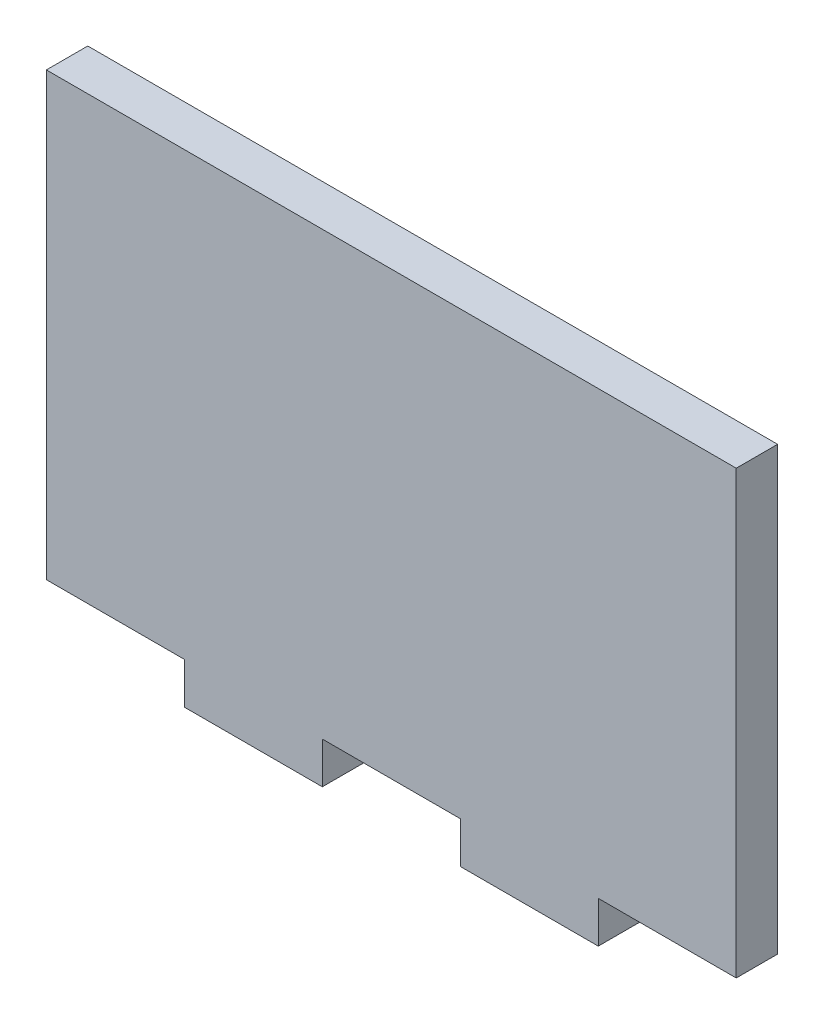
ISO-10303-21;
HEADER;
FILE_DESCRIPTION(('STEP AP214'),'2;1');
FILE_NAME('part.step','',(''),(''),'','','');
FILE_SCHEMA(('AUTOMOTIVE_DESIGN { 1 0 10303 214 1 1 1 1 }'));
ENDSEC;
DATA;
#1=APPLICATION_CONTEXT('core data for automotive mechanical design processes');
#2=APPLICATION_PROTOCOL_DEFINITION('international standard','automotive_design',2000,#1);
#3=PRODUCT_CONTEXT('',#1,'mechanical');
#4=PRODUCT('Part','Part','',(#3));
#5=PRODUCT_RELATED_PRODUCT_CATEGORY('part','',(#4));
#6=PRODUCT_DEFINITION_FORMATION('','',#4);
#7=PRODUCT_DEFINITION_CONTEXT('part definition',#1,'design');
#8=PRODUCT_DEFINITION('design','',#6,#7);
#9=PRODUCT_DEFINITION_SHAPE('','',#8);
#10=(LENGTH_UNIT() NAMED_UNIT(*) SI_UNIT(.MILLI.,.METRE.));
#11=(NAMED_UNIT(*) PLANE_ANGLE_UNIT() SI_UNIT($,.RADIAN.));
#12=(NAMED_UNIT(*) SI_UNIT($,.STERADIAN.) SOLID_ANGLE_UNIT());
#13=UNCERTAINTY_MEASURE_WITH_UNIT(LENGTH_MEASURE(1.E-05),#10,'distance_accuracy_value','');
#14=(GEOMETRIC_REPRESENTATION_CONTEXT(3) GLOBAL_UNCERTAINTY_ASSIGNED_CONTEXT((#13)) GLOBAL_UNIT_ASSIGNED_CONTEXT((#10,
#11,#12)) REPRESENTATION_CONTEXT('',''));
#15=CARTESIAN_POINT('',(0.,0.,0.));
#16=DIRECTION('',(0.,0.,1.));
#17=DIRECTION('',(1.,0.,0.));
#18=AXIS2_PLACEMENT_3D('',#15,#16,#17);
#19=CARTESIAN_POINT('',(0.,0.,6.));
#20=DIRECTION('',(0.,1.,0.));
#21=DIRECTION('',(-1.,0.,0.));
#22=AXIS2_PLACEMENT_3D('',#19,#20,#21);
#23=PLANE('',#22);
#24=DIRECTION('',(0.,0.,-1.));
#25=VECTOR('',#24,1.);
#26=CARTESIAN_POINT('',(-40.,0.,6.));
#27=LINE('',#26,#25);
#28=CARTESIAN_POINT('',(-40.,0.,6.));
#29=VERTEX_POINT('',#28);
#30=CARTESIAN_POINT('',(-40.,0.,0.));
#31=VERTEX_POINT('',#30);
#32=EDGE_CURVE('E58',#29,#31,#27,.T.);
#33=ORIENTED_EDGE('',*,*,#32,.F.);
#34=DIRECTION('',(1.,0.,0.));
#35=VECTOR('',#34,1.);
#36=CARTESIAN_POINT('',(0.,0.,6.));
#37=LINE('',#36,#35);
#38=CARTESIAN_POINT('',(-60.,0.,6.));
#39=VERTEX_POINT('',#38);
#40=EDGE_CURVE('E211',#39,#29,#37,.T.);
#41=ORIENTED_EDGE('',*,*,#40,.F.);
#42=DIRECTION('',(0.,0.,1.));
#43=VECTOR('',#42,1.);
#44=CARTESIAN_POINT('',(-60.,0.,6.));
#45=LINE('',#44,#43);
#46=CARTESIAN_POINT('',(-60.,0.,0.));
#47=VERTEX_POINT('',#46);
#48=EDGE_CURVE('E152',#47,#39,#45,.T.);
#49=ORIENTED_EDGE('',*,*,#48,.F.);
#50=DIRECTION('',(1.,0.,0.));
#51=VECTOR('',#50,1.);
#52=CARTESIAN_POINT('',(0.,0.,0.));
#53=LINE('',#52,#51);
#54=EDGE_CURVE('E182',#47,#31,#53,.T.);
#55=ORIENTED_EDGE('',*,*,#54,.T.);
#56=EDGE_LOOP('',(#33,#41,#49,#55));
#57=FACE_BOUND('',#56,.T.);
#58=ADVANCED_FACE('F33',(#57),#23,.F.);
#59=DIRECTION('',(0.,0.,1.));
#60=VECTOR('',#59,1.);
#61=CARTESIAN_POINT('',(-20.,0.,6.));
#62=LINE('',#61,#60);
#63=CARTESIAN_POINT('',(-20.,0.,0.));
#64=VERTEX_POINT('',#63);
#65=CARTESIAN_POINT('',(-20.,0.,6.));
#66=VERTEX_POINT('',#65);
#67=EDGE_CURVE('E146',#64,#66,#62,.T.);
#68=ORIENTED_EDGE('',*,*,#67,.F.);
#69=CARTESIAN_POINT('',(0.,0.,0.));
#70=VERTEX_POINT('',#69);
#71=EDGE_CURVE('E180',#64,#70,#53,.T.);
#72=ORIENTED_EDGE('',*,*,#71,.T.);
#73=DIRECTION('',(0.,0.,-1.));
#74=VECTOR('',#73,1.);
#75=CARTESIAN_POINT('',(0.,0.,6.));
#76=LINE('',#75,#74);
#77=CARTESIAN_POINT('',(0.,0.,6.));
#78=VERTEX_POINT('',#77);
#79=EDGE_CURVE('E188',#78,#70,#76,.T.);
#80=ORIENTED_EDGE('',*,*,#79,.F.);
#81=EDGE_CURVE('E37',#66,#78,#37,.T.);
#82=ORIENTED_EDGE('',*,*,#81,.F.);
#83=EDGE_LOOP('',(#68,#72,#80,#82));
#84=FACE_BOUND('',#83,.T.);
#85=ADVANCED_FACE('F269',(#84),#23,.F.);
#86=DIRECTION('',(0.,0.,-1.));
#87=VECTOR('',#86,1.);
#88=CARTESIAN_POINT('',(-80.,0.,6.));
#89=LINE('',#88,#87);
#90=CARTESIAN_POINT('',(-80.,0.,6.));
#91=VERTEX_POINT('',#90);
#92=CARTESIAN_POINT('',(-80.,0.,0.));
#93=VERTEX_POINT('',#92);
#94=EDGE_CURVE('E149',#91,#93,#89,.T.);
#95=ORIENTED_EDGE('',*,*,#94,.F.);
#96=CARTESIAN_POINT('',(-100.,0.,6.));
#97=VERTEX_POINT('',#96);
#98=EDGE_CURVE('E206',#97,#91,#37,.T.);
#99=ORIENTED_EDGE('',*,*,#98,.F.);
#100=DIRECTION('',(0.,0.,-1.));
#101=VECTOR('',#100,1.);
#102=CARTESIAN_POINT('',(-100.,0.,6.));
#103=LINE('',#102,#101);
#104=CARTESIAN_POINT('',(-100.,0.,0.));
#105=VERTEX_POINT('',#104);
#106=EDGE_CURVE('E199',#97,#105,#103,.T.);
#107=ORIENTED_EDGE('',*,*,#106,.T.);
#108=EDGE_CURVE('E195',#105,#93,#53,.T.);
#109=ORIENTED_EDGE('',*,*,#108,.T.);
#110=EDGE_LOOP('',(#95,#99,#107,#109));
#111=FACE_BOUND('',#110,.T.);
#112=ADVANCED_FACE('F234',(#111),#23,.F.);
#113=CARTESIAN_POINT('',(0.,0.,6.));
#114=DIRECTION('',(-1.,0.,0.));
#115=DIRECTION('',(0.,-1.,0.));
#116=AXIS2_PLACEMENT_3D('',#113,#114,#115);
#117=PLANE('',#116);
#118=DIRECTION('',(0.,1.,0.));
#119=VECTOR('',#118,1.);
#120=CARTESIAN_POINT('',(0.,0.,0.));
#121=LINE('',#120,#119);
#122=CARTESIAN_POINT('',(0.,64.,0.));
#123=VERTEX_POINT('',#122);
#124=EDGE_CURVE('E221',#70,#123,#121,.T.);
#125=ORIENTED_EDGE('',*,*,#124,.T.);
#126=DIRECTION('',(0.,0.,-1.));
#127=VECTOR('',#126,1.);
#128=CARTESIAN_POINT('',(0.,64.,6.));
#129=LINE('',#128,#127);
#130=CARTESIAN_POINT('',(0.,64.,6.));
#131=VERTEX_POINT('',#130);
#132=EDGE_CURVE('E11',#131,#123,#129,.T.);
#133=ORIENTED_EDGE('',*,*,#132,.F.);
#134=DIRECTION('',(0.,1.,0.));
#135=VECTOR('',#134,1.);
#136=CARTESIAN_POINT('',(0.,0.,6.));
#137=LINE('',#136,#135);
#138=EDGE_CURVE('E196',#78,#131,#137,.T.);
#139=ORIENTED_EDGE('',*,*,#138,.F.);
#140=ORIENTED_EDGE('',*,*,#79,.T.);
#141=EDGE_LOOP('',(#125,#133,#139,#140));
#142=FACE_BOUND('',#141,.T.);
#143=ADVANCED_FACE('F35',(#142),#117,.F.);
#144=CARTESIAN_POINT('',(0.,64.,6.));
#145=DIRECTION('',(0.,-1.,0.));
#146=DIRECTION('',(1.,0.,0.));
#147=AXIS2_PLACEMENT_3D('',#144,#145,#146);
#148=PLANE('',#147);
#149=DIRECTION('',(-1.,0.,0.));
#150=VECTOR('',#149,1.);
#151=CARTESIAN_POINT('',(0.,64.,0.));
#152=LINE('',#151,#150);
#153=CARTESIAN_POINT('',(-100.,64.,0.));
#154=VERTEX_POINT('',#153);
#155=EDGE_CURVE('E224',#123,#154,#152,.T.);
#156=ORIENTED_EDGE('',*,*,#155,.T.);
#157=DIRECTION('',(0.,0.,-1.));
#158=VECTOR('',#157,1.);
#159=CARTESIAN_POINT('',(-100.,64.,6.));
#160=LINE('',#159,#158);
#161=CARTESIAN_POINT('',(-100.,64.,6.));
#162=VERTEX_POINT('',#161);
#163=EDGE_CURVE('E43',#162,#154,#160,.T.);
#164=ORIENTED_EDGE('',*,*,#163,.F.);
#165=DIRECTION('',(-1.,0.,0.));
#166=VECTOR('',#165,1.);
#167=CARTESIAN_POINT('',(0.,64.,6.));
#168=LINE('',#167,#166);
#169=EDGE_CURVE('E270',#131,#162,#168,.T.);
#170=ORIENTED_EDGE('',*,*,#169,.F.);
#171=ORIENTED_EDGE('',*,*,#132,.T.);
#172=EDGE_LOOP('',(#156,#164,#170,#171));
#173=FACE_BOUND('',#172,.T.);
#174=ADVANCED_FACE('F271',(#173),#148,.F.);
#175=CARTESIAN_POINT('',(-100.,0.,6.));
#176=DIRECTION('',(1.,0.,0.));
#177=DIRECTION('',(0.,0.,-1.));
#178=AXIS2_PLACEMENT_3D('',#175,#176,#177);
#179=PLANE('',#178);
#180=DIRECTION('',(0.,-1.,0.));
#181=VECTOR('',#180,1.);
#182=CARTESIAN_POINT('',(-100.,0.,0.));
#183=LINE('',#182,#181);
#184=EDGE_CURVE('E183',#154,#105,#183,.T.);
#185=ORIENTED_EDGE('',*,*,#184,.T.);
#186=ORIENTED_EDGE('',*,*,#106,.F.);
#187=DIRECTION('',(0.,-1.,0.));
#188=VECTOR('',#187,1.);
#189=CARTESIAN_POINT('',(-100.,0.,6.));
#190=LINE('',#189,#188);
#191=EDGE_CURVE('E219',#162,#97,#190,.T.);
#192=ORIENTED_EDGE('',*,*,#191,.F.);
#193=ORIENTED_EDGE('',*,*,#163,.T.);
#194=EDGE_LOOP('',(#185,#186,#192,#193));
#195=FACE_BOUND('',#194,.T.);
#196=ADVANCED_FACE('F230',(#195),#179,.F.);
#197=CARTESIAN_POINT('',(0.,0.,6.));
#198=DIRECTION('',(0.,0.,1.));
#199=DIRECTION('',(1.,0.,0.));
#200=AXIS2_PLACEMENT_3D('',#197,#198,#199);
#201=PLANE('',#200);
#202=ORIENTED_EDGE('',*,*,#138,.T.);
#203=ORIENTED_EDGE('',*,*,#169,.T.);
#204=ORIENTED_EDGE('',*,*,#191,.T.);
#205=ORIENTED_EDGE('',*,*,#98,.T.);
#206=DIRECTION('',(0.,1.,0.));
#207=VECTOR('',#206,1.);
#208=CARTESIAN_POINT('',(-80.,-6.00000000000001,6.));
#209=LINE('',#208,#207);
#210=CARTESIAN_POINT('',(-80.,-6.00000000000001,6.));
#211=VERTEX_POINT('',#210);
#212=EDGE_CURVE('E167',#211,#91,#209,.T.);
#213=ORIENTED_EDGE('',*,*,#212,.F.);
#214=DIRECTION('',(-1.,0.,0.));
#215=VECTOR('',#214,1.);
#216=CARTESIAN_POINT('',(-80.,-6.00000000000001,6.));
#217=LINE('',#216,#215);
#218=CARTESIAN_POINT('',(-60.,-6.00000000000001,6.));
#219=VERTEX_POINT('',#218);
#220=EDGE_CURVE('E165',#219,#211,#217,.T.);
#221=ORIENTED_EDGE('',*,*,#220,.F.);
#222=DIRECTION('',(0.,1.,0.));
#223=VECTOR('',#222,1.);
#224=CARTESIAN_POINT('',(-60.,-6.00000000000001,6.));
#225=LINE('',#224,#223);
#226=EDGE_CURVE('E178',#219,#39,#225,.T.);
#227=ORIENTED_EDGE('',*,*,#226,.T.);
#228=ORIENTED_EDGE('',*,*,#40,.T.);
#229=DIRECTION('',(0.,1.,0.));
#230=VECTOR('',#229,1.);
#231=CARTESIAN_POINT('',(-40.,-6.,6.));
#232=LINE('',#231,#230);
#233=CARTESIAN_POINT('',(-40.,-6.,6.));
#234=VERTEX_POINT('',#233);
#235=EDGE_CURVE('E258',#234,#29,#232,.T.);
#236=ORIENTED_EDGE('',*,*,#235,.F.);
#237=DIRECTION('',(-1.,0.,0.));
#238=VECTOR('',#237,1.);
#239=CARTESIAN_POINT('',(-40.,-6.,6.));
#240=LINE('',#239,#238);
#241=CARTESIAN_POINT('',(-20.,-6.,6.));
#242=VERTEX_POINT('',#241);
#243=EDGE_CURVE('E142',#242,#234,#240,.T.);
#244=ORIENTED_EDGE('',*,*,#243,.F.);
#245=DIRECTION('',(0.,1.,0.));
#246=VECTOR('',#245,1.);
#247=CARTESIAN_POINT('',(-20.,-6.,6.));
#248=LINE('',#247,#246);
#249=EDGE_CURVE('E154',#242,#66,#248,.T.);
#250=ORIENTED_EDGE('',*,*,#249,.T.);
#251=ORIENTED_EDGE('',*,*,#81,.T.);
#252=EDGE_LOOP('',(#202,#203,#204,#205,#213,#221,#227,#228,#236,#244,#250,#251));
#253=FACE_BOUND('',#252,.T.);
#254=ADVANCED_FACE('F240',(#253),#201,.T.);
#255=CARTESIAN_POINT('',(0.,0.,0.));
#256=DIRECTION('',(0.,0.,1.));
#257=DIRECTION('',(1.,0.,0.));
#258=AXIS2_PLACEMENT_3D('',#255,#256,#257);
#259=PLANE('',#258);
#260=ORIENTED_EDGE('',*,*,#124,.F.);
#261=ORIENTED_EDGE('',*,*,#71,.F.);
#262=DIRECTION('',(0.,1.,0.));
#263=VECTOR('',#262,1.);
#264=CARTESIAN_POINT('',(-20.,-6.,0.));
#265=LINE('',#264,#263);
#266=CARTESIAN_POINT('',(-20.,-6.,0.));
#267=VERTEX_POINT('',#266);
#268=EDGE_CURVE('E133',#267,#64,#265,.T.);
#269=ORIENTED_EDGE('',*,*,#268,.F.);
#270=DIRECTION('',(1.,0.,0.));
#271=VECTOR('',#270,1.);
#272=CARTESIAN_POINT('',(-40.,-6.,0.));
#273=LINE('',#272,#271);
#274=CARTESIAN_POINT('',(-40.,-6.,0.));
#275=VERTEX_POINT('',#274);
#276=EDGE_CURVE('E125',#275,#267,#273,.T.);
#277=ORIENTED_EDGE('',*,*,#276,.F.);
#278=DIRECTION('',(0.,1.,0.));
#279=VECTOR('',#278,1.);
#280=CARTESIAN_POINT('',(-40.,-6.,0.));
#281=LINE('',#280,#279);
#282=EDGE_CURVE('E131',#275,#31,#281,.T.);
#283=ORIENTED_EDGE('',*,*,#282,.T.);
#284=ORIENTED_EDGE('',*,*,#54,.F.);
#285=DIRECTION('',(0.,1.,0.));
#286=VECTOR('',#285,1.);
#287=CARTESIAN_POINT('',(-60.,-6.00000000000001,0.));
#288=LINE('',#287,#286);
#289=CARTESIAN_POINT('',(-60.,-6.00000000000001,0.));
#290=VERTEX_POINT('',#289);
#291=EDGE_CURVE('E251',#290,#47,#288,.T.);
#292=ORIENTED_EDGE('',*,*,#291,.F.);
#293=DIRECTION('',(1.,0.,0.));
#294=VECTOR('',#293,1.);
#295=CARTESIAN_POINT('',(-80.,-6.00000000000001,0.));
#296=LINE('',#295,#294);
#297=CARTESIAN_POINT('',(-80.,-6.00000000000001,0.));
#298=VERTEX_POINT('',#297);
#299=EDGE_CURVE('E161',#298,#290,#296,.T.);
#300=ORIENTED_EDGE('',*,*,#299,.F.);
#301=DIRECTION('',(0.,1.,0.));
#302=VECTOR('',#301,1.);
#303=CARTESIAN_POINT('',(-80.,-6.00000000000001,0.));
#304=LINE('',#303,#302);
#305=EDGE_CURVE('E225',#298,#93,#304,.T.);
#306=ORIENTED_EDGE('',*,*,#305,.T.);
#307=ORIENTED_EDGE('',*,*,#108,.F.);
#308=ORIENTED_EDGE('',*,*,#184,.F.);
#309=ORIENTED_EDGE('',*,*,#155,.F.);
#310=EDGE_LOOP('',(#260,#261,#269,#277,#283,#284,#292,#300,#306,#307,#308,#309));
#311=FACE_BOUND('',#310,.T.);
#312=ADVANCED_FACE('F128',(#311),#259,.F.);
#313=CARTESIAN_POINT('',(-80.,-6.00000000000001,6.));
#314=DIRECTION('',(1.,0.,0.));
#315=DIRECTION('',(0.,1.,0.));
#316=AXIS2_PLACEMENT_3D('',#313,#314,#315);
#317=PLANE('',#316);
#318=ORIENTED_EDGE('',*,*,#94,.T.);
#319=ORIENTED_EDGE('',*,*,#305,.F.);
#320=DIRECTION('',(0.,0.,-1.));
#321=VECTOR('',#320,1.);
#322=CARTESIAN_POINT('',(-80.,-6.00000000000001,6.));
#323=LINE('',#322,#321);
#324=EDGE_CURVE('E158',#211,#298,#323,.T.);
#325=ORIENTED_EDGE('',*,*,#324,.F.);
#326=ORIENTED_EDGE('',*,*,#212,.T.);
#327=EDGE_LOOP('',(#318,#319,#325,#326));
#328=FACE_BOUND('',#327,.T.);
#329=ADVANCED_FACE('F236',(#328),#317,.F.);
#330=CARTESIAN_POINT('',(-60.,-6.00000000000001,6.));
#331=DIRECTION('',(-1.,0.,0.));
#332=DIRECTION('',(0.,-1.,0.));
#333=AXIS2_PLACEMENT_3D('',#330,#331,#332);
#334=PLANE('',#333);
#335=ORIENTED_EDGE('',*,*,#48,.T.);
#336=ORIENTED_EDGE('',*,*,#226,.F.);
#337=DIRECTION('',(0.,0.,1.));
#338=VECTOR('',#337,1.);
#339=CARTESIAN_POINT('',(-60.,-6.00000000000001,6.));
#340=LINE('',#339,#338);
#341=EDGE_CURVE('E163',#290,#219,#340,.T.);
#342=ORIENTED_EDGE('',*,*,#341,.F.);
#343=ORIENTED_EDGE('',*,*,#291,.T.);
#344=EDGE_LOOP('',(#335,#336,#342,#343));
#345=FACE_BOUND('',#344,.T.);
#346=ADVANCED_FACE('F250',(#345),#334,.F.);
#347=CARTESIAN_POINT('',(0.,-6.,0.));
#348=DIRECTION('',(0.,-1.,0.));
#349=DIRECTION('',(1.,0.,0.));
#350=AXIS2_PLACEMENT_3D('',#347,#348,#349);
#351=PLANE('',#350);
#352=ORIENTED_EDGE('',*,*,#324,.T.);
#353=ORIENTED_EDGE('',*,*,#299,.T.);
#354=ORIENTED_EDGE('',*,*,#341,.T.);
#355=ORIENTED_EDGE('',*,*,#220,.T.);
#356=EDGE_LOOP('',(#352,#353,#354,#355));
#357=FACE_BOUND('',#356,.T.);
#358=ADVANCED_FACE('F244',(#357),#351,.T.);
#359=CARTESIAN_POINT('',(-40.,-6.,6.));
#360=DIRECTION('',(1.,0.,0.));
#361=DIRECTION('',(0.,1.,0.));
#362=AXIS2_PLACEMENT_3D('',#359,#360,#361);
#363=PLANE('',#362);
#364=ORIENTED_EDGE('',*,*,#32,.T.);
#365=ORIENTED_EDGE('',*,*,#282,.F.);
#366=DIRECTION('',(0.,0.,-1.));
#367=VECTOR('',#366,1.);
#368=CARTESIAN_POINT('',(-40.,-6.,6.));
#369=LINE('',#368,#367);
#370=EDGE_CURVE('E137',#234,#275,#369,.T.);
#371=ORIENTED_EDGE('',*,*,#370,.F.);
#372=ORIENTED_EDGE('',*,*,#235,.T.);
#373=EDGE_LOOP('',(#364,#365,#371,#372));
#374=FACE_BOUND('',#373,.T.);
#375=ADVANCED_FACE('F148',(#374),#363,.F.);
#376=CARTESIAN_POINT('',(-20.,-6.,6.));
#377=DIRECTION('',(-1.,0.,0.));
#378=DIRECTION('',(0.,0.,1.));
#379=AXIS2_PLACEMENT_3D('',#376,#377,#378);
#380=PLANE('',#379);
#381=ORIENTED_EDGE('',*,*,#67,.T.);
#382=ORIENTED_EDGE('',*,*,#249,.F.);
#383=DIRECTION('',(0.,0.,1.));
#384=VECTOR('',#383,1.);
#385=CARTESIAN_POINT('',(-20.,-6.,6.));
#386=LINE('',#385,#384);
#387=EDGE_CURVE('E136',#267,#242,#386,.T.);
#388=ORIENTED_EDGE('',*,*,#387,.F.);
#389=ORIENTED_EDGE('',*,*,#268,.T.);
#390=EDGE_LOOP('',(#381,#382,#388,#389));
#391=FACE_BOUND('',#390,.T.);
#392=ADVANCED_FACE('F267',(#391),#380,.F.);
#393=CARTESIAN_POINT('',(0.,-6.,0.));
#394=DIRECTION('',(0.,-1.,0.));
#395=DIRECTION('',(1.,0.,0.));
#396=AXIS2_PLACEMENT_3D('',#393,#394,#395);
#397=PLANE('',#396);
#398=ORIENTED_EDGE('',*,*,#370,.T.);
#399=ORIENTED_EDGE('',*,*,#276,.T.);
#400=ORIENTED_EDGE('',*,*,#387,.T.);
#401=ORIENTED_EDGE('',*,*,#243,.T.);
#402=EDGE_LOOP('',(#398,#399,#400,#401));
#403=FACE_BOUND('',#402,.T.);
#404=ADVANCED_FACE('F140',(#403),#397,.T.);
#405=CLOSED_SHELL('',(#58,#85,#112,#143,#174,#196,#254,#312,#329,#346,#358,#375,#392,#404));
#406=MANIFOLD_SOLID_BREP('B2',#405);
#407=ADVANCED_BREP_SHAPE_REPRESENTATION('',(#18,#406),#14);
#408=SHAPE_DEFINITION_REPRESENTATION(#9,#407);
ENDSEC;
END-ISO-10303-21;
